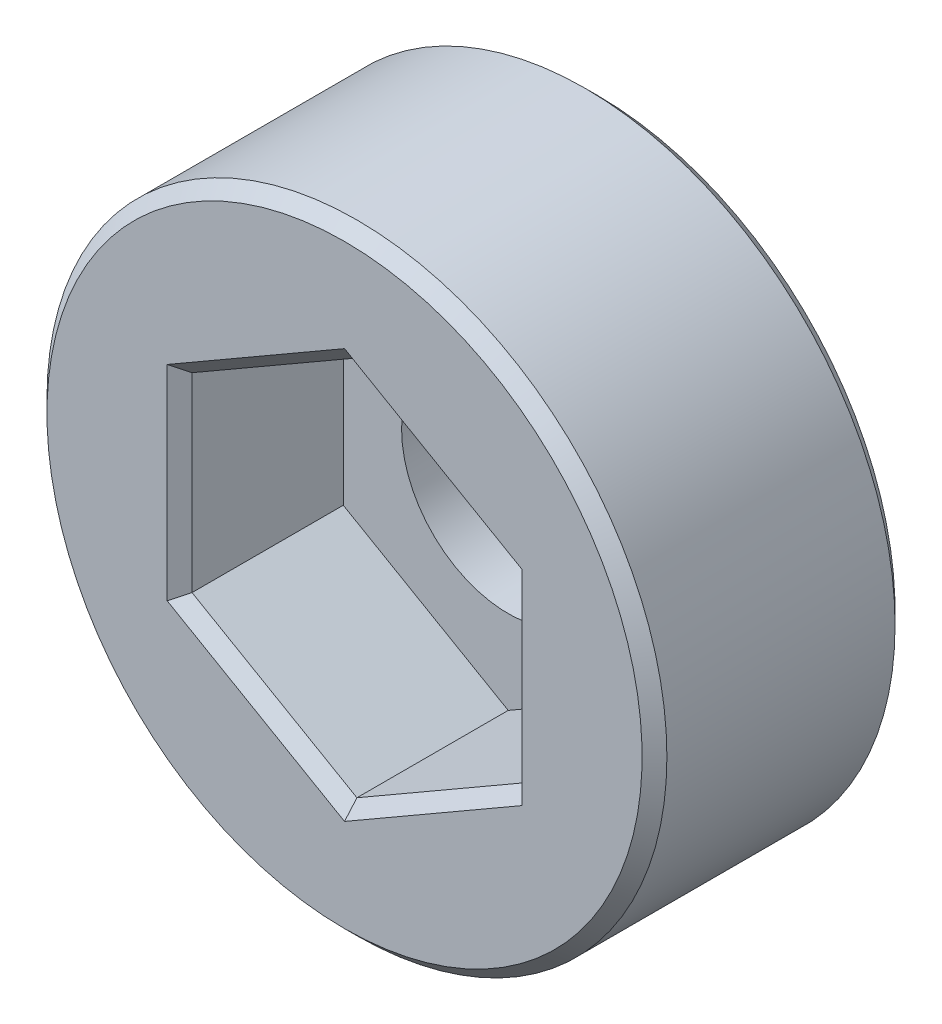
ISO-10303-21;
HEADER;
FILE_DESCRIPTION(('STEP AP214'),'2;1');
FILE_NAME('part.step','',(''),(''),'','','');
FILE_SCHEMA(('AUTOMOTIVE_DESIGN { 1 0 10303 214 1 1 1 1 }'));
ENDSEC;
DATA;
#1=APPLICATION_CONTEXT('core data for automotive mechanical design processes');
#2=APPLICATION_PROTOCOL_DEFINITION('international standard','automotive_design',2000,#1);
#3=PRODUCT_CONTEXT('',#1,'mechanical');
#4=PRODUCT('Part','Part','',(#3));
#5=PRODUCT_RELATED_PRODUCT_CATEGORY('part','',(#4));
#6=PRODUCT_DEFINITION_FORMATION('','',#4);
#7=PRODUCT_DEFINITION_CONTEXT('part definition',#1,'design');
#8=PRODUCT_DEFINITION('design','',#6,#7);
#9=PRODUCT_DEFINITION_SHAPE('','',#8);
#10=(LENGTH_UNIT() NAMED_UNIT(*) SI_UNIT(.MILLI.,.METRE.));
#11=(NAMED_UNIT(*) PLANE_ANGLE_UNIT() SI_UNIT($,.RADIAN.));
#12=(NAMED_UNIT(*) SI_UNIT($,.STERADIAN.) SOLID_ANGLE_UNIT());
#13=UNCERTAINTY_MEASURE_WITH_UNIT(LENGTH_MEASURE(1.E-05),#10,'distance_accuracy_value','');
#14=(GEOMETRIC_REPRESENTATION_CONTEXT(3) GLOBAL_UNCERTAINTY_ASSIGNED_CONTEXT((#13)) GLOBAL_UNIT_ASSIGNED_CONTEXT((#10,
#11,#12)) REPRESENTATION_CONTEXT('',''));
#15=CARTESIAN_POINT('',(0.,0.,0.));
#16=DIRECTION('',(0.,0.,1.));
#17=DIRECTION('',(1.,0.,0.));
#18=AXIS2_PLACEMENT_3D('',#15,#16,#17);
#19=CARTESIAN_POINT('',(0.,12.5,10.2));
#20=DIRECTION('',(0.,0.,-1.));
#21=DIRECTION('',(0.,1.,0.));
#22=AXIS2_PLACEMENT_3D('',#19,#20,#21);
#23=PLANE('',#22);
#24=CARTESIAN_POINT('',(0.,0.,10.2));
#25=DIRECTION('',(0.,0.,-1.));
#26=DIRECTION('',(0.,1.,0.));
#27=AXIS2_PLACEMENT_3D('',#24,#25,#26);
#28=CIRCLE('',#27,12.);
#29=CARTESIAN_POINT('',(0.,12.,10.2));
#30=VERTEX_POINT('',#29);
#31=EDGE_CURVE('E163',#30,#30,#28,.F.);
#32=ORIENTED_EDGE('',*,*,#31,.T.);
#33=EDGE_LOOP('',(#32));
#34=FACE_BOUND('',#33,.T.);
#35=DIRECTION('',(0.866025403784439,-0.5,0.));
#36=VECTOR('',#35,1.);
#37=CARTESIAN_POINT('',(-1.83765877365274,9.31708163705873,10.2));
#38=LINE('',#37,#36);
#39=CARTESIAN_POINT('',(0.,8.25610884941165,10.2));
#40=VERTEX_POINT('',#39);
#41=CARTESIAN_POINT('',(7.15,4.12805442470583,10.2));
#42=VERTEX_POINT('',#41);
#43=EDGE_CURVE('E158',#40,#42,#38,.T.);
#44=ORIENTED_EDGE('',*,*,#43,.T.);
#45=DIRECTION('',(0.,-1.,0.));
#46=VECTOR('',#45,1.);
#47=CARTESIAN_POINT('',(7.15,12.5,10.2));
#48=LINE('',#47,#46);
#49=CARTESIAN_POINT('',(7.15,-4.12805442470583,10.2));
#50=VERTEX_POINT('',#49);
#51=EDGE_CURVE('E160',#42,#50,#48,.T.);
#52=ORIENTED_EDGE('',*,*,#51,.T.);
#53=DIRECTION('',(-0.866025403784439,-0.5,0.));
#54=VECTOR('',#53,1.);
#55=CARTESIAN_POINT('',(8.98765877365274,-3.06708163705875,10.2));
#56=LINE('',#55,#54);
#57=CARTESIAN_POINT('',(0.,-8.25610884941165,10.2));
#58=VERTEX_POINT('',#57);
#59=EDGE_CURVE('E141',#50,#58,#56,.T.);
#60=ORIENTED_EDGE('',*,*,#59,.T.);
#61=DIRECTION('',(-0.866025403784439,0.5,0.));
#62=VECTOR('',#61,1.);
#63=CARTESIAN_POINT('',(-8.98765877365274,-3.06708163705875,10.2));
#64=LINE('',#63,#62);
#65=CARTESIAN_POINT('',(-7.15,-4.12805442470583,10.2));
#66=VERTEX_POINT('',#65);
#67=EDGE_CURVE('E152',#58,#66,#64,.T.);
#68=ORIENTED_EDGE('',*,*,#67,.T.);
#69=DIRECTION('',(0.,1.,0.));
#70=VECTOR('',#69,1.);
#71=CARTESIAN_POINT('',(-7.15,12.5,10.2));
#72=LINE('',#71,#70);
#73=CARTESIAN_POINT('',(-7.15,4.12805442470583,10.2));
#74=VERTEX_POINT('',#73);
#75=EDGE_CURVE('E154',#66,#74,#72,.T.);
#76=ORIENTED_EDGE('',*,*,#75,.T.);
#77=DIRECTION('',(0.866025403784439,0.5,0.));
#78=VECTOR('',#77,1.);
#79=CARTESIAN_POINT('',(1.83765877365274,9.31708163705874,10.2));
#80=LINE('',#79,#78);
#81=EDGE_CURVE('E156',#74,#40,#80,.T.);
#82=ORIENTED_EDGE('',*,*,#81,.T.);
#83=EDGE_LOOP('',(#44,#52,#60,#68,#76,#82));
#84=FACE_BOUND('',#83,.T.);
#85=ADVANCED_FACE('F32',(#34,#84),#23,.F.);
#86=CARTESIAN_POINT('',(0.,0.,10.2));
#87=DIRECTION('',(0.,0.,1.));
#88=DIRECTION('',(0.,-1.,0.));
#89=AXIS2_PLACEMENT_3D('',#86,#87,#88);
#90=CYLINDRICAL_SURFACE('',#89,12.5);
#91=CARTESIAN_POINT('',(0.,0.,9.69999999999999));
#92=DIRECTION('',(0.,0.,-1.));
#93=DIRECTION('',(0.,1.,0.));
#94=AXIS2_PLACEMENT_3D('',#91,#92,#93);
#95=CIRCLE('',#94,12.5);
#96=CARTESIAN_POINT('',(0.,12.5,9.69999999999999));
#97=VERTEX_POINT('',#96);
#98=EDGE_CURVE('E169',#97,#97,#95,.T.);
#99=ORIENTED_EDGE('',*,*,#98,.T.);
#100=EDGE_LOOP('',(#99));
#101=FACE_BOUND('',#100,.T.);
#102=CARTESIAN_POINT('',(0.,0.,0.499999999999994));
#103=DIRECTION('',(0.,0.,1.));
#104=DIRECTION('',(0.,-1.,0.));
#105=AXIS2_PLACEMENT_3D('',#102,#103,#104);
#106=CIRCLE('',#105,12.5);
#107=CARTESIAN_POINT('',(0.,-12.5,0.499999999999991));
#108=VERTEX_POINT('',#107);
#109=EDGE_CURVE('E166',#108,#108,#106,.T.);
#110=ORIENTED_EDGE('',*,*,#109,.T.);
#111=EDGE_LOOP('',(#110));
#112=FACE_BOUND('',#111,.T.);
#113=ADVANCED_FACE('F241',(#101,#112),#90,.T.);
#114=CARTESIAN_POINT('',(0.,12.5,0.));
#115=DIRECTION('',(0.,0.,1.));
#116=DIRECTION('',(0.,-1.,0.));
#117=AXIS2_PLACEMENT_3D('',#114,#115,#116);
#118=PLANE('',#117);
#119=CARTESIAN_POINT('',(0.,0.,0.));
#120=DIRECTION('',(0.,0.,1.));
#121=DIRECTION('',(0.,-1.,0.));
#122=AXIS2_PLACEMENT_3D('',#119,#120,#121);
#123=CIRCLE('',#122,4.79999999999999);
#124=CARTESIAN_POINT('',(0.,-4.79999999999999,0.));
#125=VERTEX_POINT('',#124);
#126=EDGE_CURVE('E41',#125,#125,#123,.T.);
#127=ORIENTED_EDGE('',*,*,#126,.T.);
#128=EDGE_LOOP('',(#127));
#129=FACE_BOUND('',#128,.T.);
#130=CARTESIAN_POINT('',(0.,0.,0.));
#131=DIRECTION('',(0.,0.,1.));
#132=DIRECTION('',(0.,-1.,0.));
#133=AXIS2_PLACEMENT_3D('',#130,#131,#132);
#134=CIRCLE('',#133,12.);
#135=CARTESIAN_POINT('',(0.,-12.,0.));
#136=VERTEX_POINT('',#135);
#137=EDGE_CURVE('E183',#136,#136,#134,.F.);
#138=ORIENTED_EDGE('',*,*,#137,.T.);
#139=EDGE_LOOP('',(#138));
#140=FACE_BOUND('',#139,.T.);
#141=ADVANCED_FACE('F237',(#129,#140),#118,.F.);
#142=CARTESIAN_POINT('',(-6.65,-3.83937929011101,3.6));
#143=DIRECTION('',(-0.5,-0.866025403784439,0.));
#144=DIRECTION('',(0.866025403784439,-0.5,0.));
#145=AXIS2_PLACEMENT_3D('',#142,#143,#144);
#146=PLANE('',#145);
#147=DIRECTION('',(0.,0.,1.));
#148=VECTOR('',#147,1.);
#149=CARTESIAN_POINT('',(-6.65,-3.83937929011101,3.6));
#150=LINE('',#149,#148);
#151=CARTESIAN_POINT('',(-6.65,-3.83937929011101,3.6));
#152=VERTEX_POINT('',#151);
#153=CARTESIAN_POINT('',(-6.65,-3.83937929011101,9.69999999999999));
#154=VERTEX_POINT('',#153);
#155=EDGE_CURVE('E139',#152,#154,#150,.T.);
#156=ORIENTED_EDGE('',*,*,#155,.T.);
#157=DIRECTION('',(0.866025403784439,-0.5,0.));
#158=VECTOR('',#157,1.);
#159=CARTESIAN_POINT('',(-6.65,-3.83937929011101,9.69999999999999));
#160=LINE('',#159,#158);
#161=CARTESIAN_POINT('',(0.,-7.67875858022202,9.69999999999999));
#162=VERTEX_POINT('',#161);
#163=EDGE_CURVE('E49',#154,#162,#160,.T.);
#164=ORIENTED_EDGE('',*,*,#163,.T.);
#165=DIRECTION('',(0.,0.,1.));
#166=VECTOR('',#165,1.);
#167=CARTESIAN_POINT('',(0.,-7.67875858022202,3.6));
#168=LINE('',#167,#166);
#169=CARTESIAN_POINT('',(0.,-7.67875858022202,3.6));
#170=VERTEX_POINT('',#169);
#171=EDGE_CURVE('E104',#170,#162,#168,.T.);
#172=ORIENTED_EDGE('',*,*,#171,.F.);
#173=DIRECTION('',(0.866025403784439,-0.5,0.));
#174=VECTOR('',#173,1.);
#175=CARTESIAN_POINT('',(-6.65,-3.83937929011101,3.6));
#176=LINE('',#175,#174);
#177=EDGE_CURVE('E108',#152,#170,#176,.T.);
#178=ORIENTED_EDGE('',*,*,#177,.F.);
#179=EDGE_LOOP('',(#156,#164,#172,#178));
#180=FACE_BOUND('',#179,.T.);
#181=ADVANCED_FACE('F106',(#180),#146,.F.);
#182=CARTESIAN_POINT('',(-6.65,3.83937929011101,3.6));
#183=DIRECTION('',(-1.,0.,0.));
#184=DIRECTION('',(0.,0.,1.));
#185=AXIS2_PLACEMENT_3D('',#182,#183,#184);
#186=PLANE('',#185);
#187=DIRECTION('',(0.,0.,1.));
#188=VECTOR('',#187,1.);
#189=CARTESIAN_POINT('',(-6.65,3.83937929011101,3.6));
#190=LINE('',#189,#188);
#191=CARTESIAN_POINT('',(-6.65,3.83937929011101,3.6));
#192=VERTEX_POINT('',#191);
#193=CARTESIAN_POINT('',(-6.65,3.83937929011101,9.69999999999999));
#194=VERTEX_POINT('',#193);
#195=EDGE_CURVE('E142',#192,#194,#190,.T.);
#196=ORIENTED_EDGE('',*,*,#195,.T.);
#197=DIRECTION('',(0.,-1.,0.));
#198=VECTOR('',#197,1.);
#199=CARTESIAN_POINT('',(-6.65,3.83937929011101,9.69999999999999));
#200=LINE('',#199,#198);
#201=EDGE_CURVE('E57',#194,#154,#200,.T.);
#202=ORIENTED_EDGE('',*,*,#201,.T.);
#203=ORIENTED_EDGE('',*,*,#155,.F.);
#204=DIRECTION('',(0.,-1.,0.));
#205=VECTOR('',#204,1.);
#206=CARTESIAN_POINT('',(-6.65,3.83937929011101,3.6));
#207=LINE('',#206,#205);
#208=EDGE_CURVE('E113',#192,#152,#207,.T.);
#209=ORIENTED_EDGE('',*,*,#208,.F.);
#210=EDGE_LOOP('',(#196,#202,#203,#209));
#211=FACE_BOUND('',#210,.T.);
#212=ADVANCED_FACE('F229',(#211),#186,.F.);
#213=CARTESIAN_POINT('',(0.,7.67875858022202,3.6));
#214=DIRECTION('',(-0.5,0.866025403784439,0.));
#215=DIRECTION('',(-0.866025403784439,-0.5,0.));
#216=AXIS2_PLACEMENT_3D('',#213,#214,#215);
#217=PLANE('',#216);
#218=DIRECTION('',(0.,0.,1.));
#219=VECTOR('',#218,1.);
#220=CARTESIAN_POINT('',(0.,7.67875858022202,3.6));
#221=LINE('',#220,#219);
#222=CARTESIAN_POINT('',(0.,7.67875858022202,3.6));
#223=VERTEX_POINT('',#222);
#224=CARTESIAN_POINT('',(0.,7.67875858022202,9.69999999999999));
#225=VERTEX_POINT('',#224);
#226=EDGE_CURVE('E144',#223,#225,#221,.T.);
#227=ORIENTED_EDGE('',*,*,#226,.T.);
#228=DIRECTION('',(-0.866025403784439,-0.5,0.));
#229=VECTOR('',#228,1.);
#230=CARTESIAN_POINT('',(0.,7.67875858022202,9.69999999999999));
#231=LINE('',#230,#229);
#232=EDGE_CURVE('E177',#225,#194,#231,.T.);
#233=ORIENTED_EDGE('',*,*,#232,.T.);
#234=ORIENTED_EDGE('',*,*,#195,.F.);
#235=DIRECTION('',(-0.866025403784439,-0.5,0.));
#236=VECTOR('',#235,1.);
#237=CARTESIAN_POINT('',(0.,7.67875858022202,3.6));
#238=LINE('',#237,#236);
#239=EDGE_CURVE('E136',#223,#192,#238,.T.);
#240=ORIENTED_EDGE('',*,*,#239,.F.);
#241=EDGE_LOOP('',(#227,#233,#234,#240));
#242=FACE_BOUND('',#241,.T.);
#243=ADVANCED_FACE('F228',(#242),#217,.F.);
#244=CARTESIAN_POINT('',(6.65,3.83937929011101,3.6));
#245=DIRECTION('',(0.5,0.866025403784439,0.));
#246=DIRECTION('',(-0.866025403784439,0.5,0.));
#247=AXIS2_PLACEMENT_3D('',#244,#245,#246);
#248=PLANE('',#247);
#249=DIRECTION('',(0.,0.,1.));
#250=VECTOR('',#249,1.);
#251=CARTESIAN_POINT('',(6.65,3.83937929011101,3.6));
#252=LINE('',#251,#250);
#253=CARTESIAN_POINT('',(6.65,3.83937929011101,3.6));
#254=VERTEX_POINT('',#253);
#255=CARTESIAN_POINT('',(6.65,3.83937929011101,9.7));
#256=VERTEX_POINT('',#255);
#257=EDGE_CURVE('E147',#254,#256,#252,.T.);
#258=ORIENTED_EDGE('',*,*,#257,.T.);
#259=DIRECTION('',(-0.866025403784439,0.5,0.));
#260=VECTOR('',#259,1.);
#261=CARTESIAN_POINT('',(6.65,3.83937929011101,9.69999999999999));
#262=LINE('',#261,#260);
#263=EDGE_CURVE('E175',#256,#225,#262,.T.);
#264=ORIENTED_EDGE('',*,*,#263,.T.);
#265=ORIENTED_EDGE('',*,*,#226,.F.);
#266=DIRECTION('',(-0.866025403784439,0.5,0.));
#267=VECTOR('',#266,1.);
#268=CARTESIAN_POINT('',(6.65,3.83937929011101,3.6));
#269=LINE('',#268,#267);
#270=EDGE_CURVE('E133',#254,#223,#269,.T.);
#271=ORIENTED_EDGE('',*,*,#270,.F.);
#272=EDGE_LOOP('',(#258,#264,#265,#271));
#273=FACE_BOUND('',#272,.T.);
#274=ADVANCED_FACE('F225',(#273),#248,.F.);
#275=CARTESIAN_POINT('',(6.65,-3.83937929011101,3.6));
#276=DIRECTION('',(1.,0.,0.));
#277=DIRECTION('',(0.,1.,0.));
#278=AXIS2_PLACEMENT_3D('',#275,#276,#277);
#279=PLANE('',#278);
#280=DIRECTION('',(0.,0.,1.));
#281=VECTOR('',#280,1.);
#282=CARTESIAN_POINT('',(6.65,-3.83937929011101,3.6));
#283=LINE('',#282,#281);
#284=CARTESIAN_POINT('',(6.65,-3.83937929011101,3.6));
#285=VERTEX_POINT('',#284);
#286=CARTESIAN_POINT('',(6.65,-3.83937929011101,9.69999999999999));
#287=VERTEX_POINT('',#286);
#288=EDGE_CURVE('E112',#285,#287,#283,.T.);
#289=ORIENTED_EDGE('',*,*,#288,.T.);
#290=DIRECTION('',(0.,1.,0.));
#291=VECTOR('',#290,1.);
#292=CARTESIAN_POINT('',(6.65,-3.83937929011101,9.69999999999999));
#293=LINE('',#292,#291);
#294=EDGE_CURVE('E172',#287,#256,#293,.T.);
#295=ORIENTED_EDGE('',*,*,#294,.T.);
#296=ORIENTED_EDGE('',*,*,#257,.F.);
#297=DIRECTION('',(0.,1.,0.));
#298=VECTOR('',#297,1.);
#299=CARTESIAN_POINT('',(6.65,-3.83937929011101,3.6));
#300=LINE('',#299,#298);
#301=EDGE_CURVE('E122',#285,#254,#300,.T.);
#302=ORIENTED_EDGE('',*,*,#301,.F.);
#303=EDGE_LOOP('',(#289,#295,#296,#302));
#304=FACE_BOUND('',#303,.T.);
#305=ADVANCED_FACE('F221',(#304),#279,.F.);
#306=CARTESIAN_POINT('',(0.,-7.67875858022202,3.6));
#307=DIRECTION('',(0.5,-0.866025403784439,0.));
#308=DIRECTION('',(0.866025403784439,0.5,0.));
#309=AXIS2_PLACEMENT_3D('',#306,#307,#308);
#310=PLANE('',#309);
#311=ORIENTED_EDGE('',*,*,#171,.T.);
#312=DIRECTION('',(0.866025403784439,0.5,0.));
#313=VECTOR('',#312,1.);
#314=CARTESIAN_POINT('',(0.,-7.67875858022202,9.69999999999999));
#315=LINE('',#314,#313);
#316=EDGE_CURVE('E181',#162,#287,#315,.T.);
#317=ORIENTED_EDGE('',*,*,#316,.T.);
#318=ORIENTED_EDGE('',*,*,#288,.F.);
#319=DIRECTION('',(0.866025403784439,0.5,0.));
#320=VECTOR('',#319,1.);
#321=CARTESIAN_POINT('',(0.,-7.67875858022202,3.6));
#322=LINE('',#321,#320);
#323=EDGE_CURVE('E116',#170,#285,#322,.T.);
#324=ORIENTED_EDGE('',*,*,#323,.F.);
#325=EDGE_LOOP('',(#311,#317,#318,#324));
#326=FACE_BOUND('',#325,.T.);
#327=ADVANCED_FACE('F117',(#326),#310,.F.);
#328=CARTESIAN_POINT('',(0.,0.,3.6));
#329=DIRECTION('',(0.,0.,1.));
#330=DIRECTION('',(1.,0.,0.));
#331=AXIS2_PLACEMENT_3D('',#328,#329,#330);
#332=PLANE('',#331);
#333=CARTESIAN_POINT('',(0.,0.,3.6));
#334=DIRECTION('',(0.,0.,1.));
#335=DIRECTION('',(1.,0.,0.));
#336=AXIS2_PLACEMENT_3D('',#333,#334,#335);
#337=CIRCLE('',#336,4.3);
#338=CARTESIAN_POINT('',(4.3,0.,3.6));
#339=VERTEX_POINT('',#338);
#340=EDGE_CURVE('E127',#339,#339,#337,.T.);
#341=ORIENTED_EDGE('',*,*,#340,.F.);
#342=EDGE_LOOP('',(#341));
#343=FACE_BOUND('',#342,.T.);
#344=ORIENTED_EDGE('',*,*,#177,.T.);
#345=ORIENTED_EDGE('',*,*,#323,.T.);
#346=ORIENTED_EDGE('',*,*,#301,.T.);
#347=ORIENTED_EDGE('',*,*,#270,.T.);
#348=ORIENTED_EDGE('',*,*,#239,.T.);
#349=ORIENTED_EDGE('',*,*,#208,.T.);
#350=EDGE_LOOP('',(#344,#345,#346,#347,#348,#349));
#351=FACE_BOUND('',#350,.T.);
#352=ADVANCED_FACE('F124',(#343,#351),#332,.T.);
#353=CARTESIAN_POINT('',(0.,0.,0.));
#354=DIRECTION('',(0.,0.,1.));
#355=DIRECTION('',(1.,0.,0.));
#356=AXIS2_PLACEMENT_3D('',#353,#354,#355);
#357=CYLINDRICAL_SURFACE('',#356,4.3);
#358=CARTESIAN_POINT('',(0.,0.,0.499999999999988));
#359=DIRECTION('',(0.,0.,1.));
#360=DIRECTION('',(1.,0.,0.));
#361=AXIS2_PLACEMENT_3D('',#358,#359,#360);
#362=CIRCLE('',#361,4.3);
#363=CARTESIAN_POINT('',(4.3,0.,0.499999999999988));
#364=VERTEX_POINT('',#363);
#365=EDGE_CURVE('E11',#364,#364,#362,.F.);
#366=CARTESIAN_POINT('',(4.3,0.,0.499999999999988));
#367=CARTESIAN_POINT('',(4.3,0.,0.532291666666655));
#368=CARTESIAN_POINT('',(4.3,0.,0.564583333333322));
#369=CARTESIAN_POINT('',(4.3,0.,0.629166666666655));
#370=CARTESIAN_POINT('',(4.3,0.,0.661458333333322));
#371=CARTESIAN_POINT('',(4.3,0.,0.726041666666656));
#372=CARTESIAN_POINT('',(4.3,0.,0.758333333333322));
#373=CARTESIAN_POINT('',(4.3,0.,0.822916666666656));
#374=CARTESIAN_POINT('',(4.3,0.,0.855208333333323));
#375=CARTESIAN_POINT('',(4.3,0.,0.919791666666656));
#376=CARTESIAN_POINT('',(4.3,0.,0.952083333333323));
#377=CARTESIAN_POINT('',(4.3,0.,1.01666666666666));
#378=CARTESIAN_POINT('',(4.3,0.,1.04895833333332));
#379=CARTESIAN_POINT('',(4.3,0.,1.11354166666666));
#380=CARTESIAN_POINT('',(4.3,0.,1.14583333333332));
#381=CARTESIAN_POINT('',(4.3,0.,1.21041666666666));
#382=CARTESIAN_POINT('',(4.3,0.,1.24270833333332));
#383=CARTESIAN_POINT('',(4.3,0.,1.30729166666666));
#384=CARTESIAN_POINT('',(4.3,0.,1.33958333333332));
#385=CARTESIAN_POINT('',(4.3,0.,1.40416666666666));
#386=CARTESIAN_POINT('',(4.3,0.,1.43645833333332));
#387=CARTESIAN_POINT('',(4.3,0.,1.50104166666666));
#388=CARTESIAN_POINT('',(4.3,0.,1.53333333333332));
#389=CARTESIAN_POINT('',(4.3,0.,1.59791666666666));
#390=CARTESIAN_POINT('',(4.3,0.,1.63020833333332));
#391=CARTESIAN_POINT('',(4.3,0.,1.69479166666666));
#392=CARTESIAN_POINT('',(4.3,0.,1.72708333333333));
#393=CARTESIAN_POINT('',(4.3,0.,1.79166666666666));
#394=CARTESIAN_POINT('',(4.3,0.,1.82395833333333));
#395=CARTESIAN_POINT('',(4.3,0.,1.88854166666666));
#396=CARTESIAN_POINT('',(4.3,0.,1.92083333333333));
#397=CARTESIAN_POINT('',(4.3,0.,1.98541666666666));
#398=CARTESIAN_POINT('',(4.3,0.,2.01770833333333));
#399=CARTESIAN_POINT('',(4.3,0.,2.08229166666666));
#400=CARTESIAN_POINT('',(4.3,0.,2.11458333333333));
#401=CARTESIAN_POINT('',(4.3,0.,2.17916666666666));
#402=CARTESIAN_POINT('',(4.3,0.,2.21145833333333));
#403=CARTESIAN_POINT('',(4.3,0.,2.27604166666666));
#404=CARTESIAN_POINT('',(4.3,0.,2.30833333333333));
#405=CARTESIAN_POINT('',(4.3,0.,2.37291666666666));
#406=CARTESIAN_POINT('',(4.3,0.,2.40520833333333));
#407=CARTESIAN_POINT('',(4.3,0.,2.46979166666666));
#408=CARTESIAN_POINT('',(4.3,0.,2.50208333333333));
#409=CARTESIAN_POINT('',(4.3,0.,2.56666666666666));
#410=CARTESIAN_POINT('',(4.3,0.,2.59895833333333));
#411=CARTESIAN_POINT('',(4.3,0.,2.66354166666666));
#412=CARTESIAN_POINT('',(4.3,0.,2.69583333333333));
#413=CARTESIAN_POINT('',(4.3,0.,2.76041666666666));
#414=CARTESIAN_POINT('',(4.3,0.,2.79270833333333));
#415=CARTESIAN_POINT('',(4.3,0.,2.85729166666666));
#416=CARTESIAN_POINT('',(4.3,0.,2.88958333333333));
#417=CARTESIAN_POINT('',(4.3,0.,2.95416666666666));
#418=CARTESIAN_POINT('',(4.3,0.,2.98645833333333));
#419=CARTESIAN_POINT('',(4.3,0.,3.05104166666666));
#420=CARTESIAN_POINT('',(4.3,0.,3.08333333333333));
#421=CARTESIAN_POINT('',(4.3,0.,3.14791666666666));
#422=CARTESIAN_POINT('',(4.3,0.,3.18020833333333));
#423=CARTESIAN_POINT('',(4.3,0.,3.24479166666666));
#424=CARTESIAN_POINT('',(4.3,0.,3.27708333333333));
#425=CARTESIAN_POINT('',(4.3,0.,3.34166666666666));
#426=CARTESIAN_POINT('',(4.3,0.,3.37395833333333));
#427=CARTESIAN_POINT('',(4.3,0.,3.43854166666666));
#428=CARTESIAN_POINT('',(4.3,0.,3.47083333333333));
#429=CARTESIAN_POINT('',(4.3,0.,3.53541666666666));
#430=CARTESIAN_POINT('',(4.3,0.,3.56770833333333));
#431=CARTESIAN_POINT('',(4.3,0.,3.6));
#432=B_SPLINE_CURVE_WITH_KNOTS('',3,(#366,#367,#368,#369,#370,#371,#372,#373,#374,#375,#376,
#377,#378,#379,#380,#381,#382,#383,#384,#385,#386,#387,#388,#389,#390,#391,#392,#393,#394,#395,
#396,#397,#398,#399,#400,#401,#402,#403,#404,#405,#406,#407,#408,#409,#410,#411,#412,#413,#414,
#415,#416,#417,#418,#419,#420,#421,#422,#423,#424,#425,#426,#427,#428,#429,#430,#431),
.UNSPECIFIED.,.F.,.F.,(4,2,2,2,2,2,2,2,2,2,2,2,2,2,2,2,2,2,2,2,2,2,2,2,2,2,2,2,2,2,2,2,4),(0.,
0.0968750000000003,0.193750000000001,0.290625000000001,0.387500000000001,0.484375000000001,
0.581250000000002,0.678125000000002,0.775000000000002,0.871875000000003,0.968750000000003,
1.065625,1.1625,1.259375,1.35625,1.453125,1.55,1.646875,1.74375000000001,1.84062500000001,
1.93750000000001,2.03437500000001,2.13125000000001,2.22812500000001,2.32500000000001,
2.42187500000001,2.51875000000001,2.61562500000001,2.71250000000001,2.80937500000001,
2.90625000000001,3.00312500000001,3.10000000000001),.UNSPECIFIED.);
#433=EDGE_CURVE('BSEAM254',#364,#339,#432,.T.);
#434=ORIENTED_EDGE('',*,*,#365,.T.);
#435=ORIENTED_EDGE('',*,*,#340,.T.);
#436=ORIENTED_EDGE('',*,*,#433,.T.);
#437=ORIENTED_EDGE('',*,*,#433,.F.);
#438=EDGE_LOOP('',(#434,#436,#435,#437));
#439=FACE_BOUND('',#438,.T.);
#440=ADVANCED_FACE('F254',(#439),#357,.F.);
#441=CARTESIAN_POINT('',(0.,0.,10.2));
#442=DIRECTION('',(0.,0.,-1.));
#443=DIRECTION('',(0.,1.,0.));
#444=AXIS2_PLACEMENT_3D('',#441,#442,#443);
#445=CONICAL_SURFACE('',#444,12.,0.785398163397443);
#446=ORIENTED_EDGE('',*,*,#98,.F.);
#447=EDGE_LOOP('',(#446));
#448=FACE_BOUND('',#447,.T.);
#449=ORIENTED_EDGE('',*,*,#31,.F.);
#450=EDGE_LOOP('',(#449));
#451=FACE_BOUND('',#450,.T.);
#452=ADVANCED_FACE('F251',(#448,#451),#445,.T.);
#453=CARTESIAN_POINT('',(-6.65,3.83937929011101,9.69999999999999));
#454=DIRECTION('',(-0.707106781186549,0.,-0.707106781186546));
#455=DIRECTION('',(0.,-1.,0.));
#456=AXIS2_PLACEMENT_3D('',#453,#454,#455);
#457=PLANE('',#456);
#458=DIRECTION('',(-0.654653670707976,0.377964473009226,0.654653670707979));
#459=VECTOR('',#458,1.);
#460=CARTESIAN_POINT('',(-4.75000000000001,2.74241377865073,7.79999999999999));
#461=LINE('',#460,#459);
#462=EDGE_CURVE('E197',#74,#194,#461,.F.);
#463=ORIENTED_EDGE('',*,*,#462,.F.);
#464=ORIENTED_EDGE('',*,*,#75,.F.);
#465=DIRECTION('',(-0.654653670707975,-0.377964473009231,0.654653670707977));
#466=VECTOR('',#465,1.);
#467=CARTESIAN_POINT('',(-4.74999999999998,-2.7424137786507,7.79999999999997));
#468=LINE('',#467,#466);
#469=EDGE_CURVE('E36',#154,#66,#468,.T.);
#470=ORIENTED_EDGE('',*,*,#469,.F.);
#471=ORIENTED_EDGE('',*,*,#201,.F.);
#472=EDGE_LOOP('',(#463,#464,#470,#471));
#473=FACE_BOUND('',#472,.T.);
#474=ADVANCED_FACE('F210',(#473),#457,.F.);
#475=CARTESIAN_POINT('',(-6.65,-3.83937929011101,9.69999999999999));
#476=DIRECTION('',(-0.353553390593273,-0.612372435695793,-0.707106781186549));
#477=DIRECTION('',(0.866025403784439,-0.5,0.));
#478=AXIS2_PLACEMENT_3D('',#475,#476,#477);
#479=PLANE('',#478);
#480=ORIENTED_EDGE('',*,*,#469,.T.);
#481=ORIENTED_EDGE('',*,*,#67,.F.);
#482=DIRECTION('',(0.,-0.755928946018456,0.654653670707976));
#483=VECTOR('',#482,1.);
#484=CARTESIAN_POINT('',(0.,-5.48482755730144,7.8));
#485=LINE('',#484,#483);
#486=EDGE_CURVE('E195',#162,#58,#485,.T.);
#487=ORIENTED_EDGE('',*,*,#486,.F.);
#488=ORIENTED_EDGE('',*,*,#163,.F.);
#489=EDGE_LOOP('',(#480,#481,#487,#488));
#490=FACE_BOUND('',#489,.T.);
#491=ADVANCED_FACE('F207',(#490),#479,.F.);
#492=CARTESIAN_POINT('',(0.,7.67875858022202,9.69999999999999));
#493=DIRECTION('',(-0.353553390593275,0.612372435695796,-0.707106781186546));
#494=DIRECTION('',(-0.866025403784439,-0.5,0.));
#495=AXIS2_PLACEMENT_3D('',#492,#493,#494);
#496=PLANE('',#495);
#497=ORIENTED_EDGE('',*,*,#462,.T.);
#498=ORIENTED_EDGE('',*,*,#232,.F.);
#499=DIRECTION('',(0.,0.755928946018453,0.654653670707979));
#500=VECTOR('',#499,1.);
#501=CARTESIAN_POINT('',(0.,5.48482755730145,7.79999999999998));
#502=LINE('',#501,#500);
#503=EDGE_CURVE('E192',#40,#225,#502,.F.);
#504=ORIENTED_EDGE('',*,*,#503,.F.);
#505=ORIENTED_EDGE('',*,*,#81,.F.);
#506=EDGE_LOOP('',(#497,#498,#504,#505));
#507=FACE_BOUND('',#506,.T.);
#508=ADVANCED_FACE('F267',(#507),#496,.F.);
#509=CARTESIAN_POINT('',(0.,-7.67875858022202,9.69999999999999));
#510=DIRECTION('',(0.353553390593273,-0.612372435695793,-0.707106781186549));
#511=DIRECTION('',(0.866025403784439,0.5,0.));
#512=AXIS2_PLACEMENT_3D('',#509,#510,#511);
#513=PLANE('',#512);
#514=ORIENTED_EDGE('',*,*,#486,.T.);
#515=ORIENTED_EDGE('',*,*,#59,.F.);
#516=DIRECTION('',(-0.654653670707976,0.37796447300923,-0.654653670707977));
#517=VECTOR('',#516,1.);
#518=CARTESIAN_POINT('',(6.65,-3.83937929011101,9.69999999999999));
#519=LINE('',#518,#517);
#520=EDGE_CURVE('E190',#287,#50,#519,.F.);
#521=ORIENTED_EDGE('',*,*,#520,.F.);
#522=ORIENTED_EDGE('',*,*,#316,.F.);
#523=EDGE_LOOP('',(#514,#515,#521,#522));
#524=FACE_BOUND('',#523,.T.);
#525=ADVANCED_FACE('F217',(#524),#513,.F.);
#526=CARTESIAN_POINT('',(6.65,3.83937929011101,9.69999999999999));
#527=DIRECTION('',(0.353553390593275,0.612372435695797,-0.707106781186545));
#528=DIRECTION('',(-0.866025403784439,0.5,0.));
#529=AXIS2_PLACEMENT_3D('',#526,#527,#528);
#530=PLANE('',#529);
#531=ORIENTED_EDGE('',*,*,#503,.T.);
#532=ORIENTED_EDGE('',*,*,#263,.F.);
#533=DIRECTION('',(0.654653670707978,0.377964473009223,0.654653670707979));
#534=VECTOR('',#533,1.);
#535=CARTESIAN_POINT('',(4.75000000000001,2.74241377865075,7.80000000000001));
#536=LINE('',#535,#534);
#537=EDGE_CURVE('E188',#42,#256,#536,.F.);
#538=ORIENTED_EDGE('',*,*,#537,.F.);
#539=ORIENTED_EDGE('',*,*,#43,.F.);
#540=EDGE_LOOP('',(#531,#532,#538,#539));
#541=FACE_BOUND('',#540,.T.);
#542=ADVANCED_FACE('F260',(#541),#530,.F.);
#543=CARTESIAN_POINT('',(6.65,-3.83937929011101,9.69999999999999));
#544=DIRECTION('',(0.707106781186548,0.,-0.707106781186547));
#545=DIRECTION('',(0.,1.,0.));
#546=AXIS2_PLACEMENT_3D('',#543,#544,#545);
#547=PLANE('',#546);
#548=ORIENTED_EDGE('',*,*,#520,.T.);
#549=ORIENTED_EDGE('',*,*,#51,.F.);
#550=ORIENTED_EDGE('',*,*,#537,.T.);
#551=ORIENTED_EDGE('',*,*,#294,.F.);
#552=EDGE_LOOP('',(#548,#549,#550,#551));
#553=FACE_BOUND('',#552,.T.);
#554=ADVANCED_FACE('F256',(#553),#547,.F.);
#555=CARTESIAN_POINT('',(0.,0.,0.));
#556=DIRECTION('',(0.,0.,-1.));
#557=DIRECTION('',(-1.,0.,0.));
#558=AXIS2_PLACEMENT_3D('',#555,#556,#557);
#559=CONICAL_SURFACE('',#558,4.79999999999999,0.785398163397446);
#560=ORIENTED_EDGE('',*,*,#365,.F.);
#561=EDGE_LOOP('',(#560));
#562=FACE_BOUND('',#561,.T.);
#563=ORIENTED_EDGE('',*,*,#126,.F.);
#564=EDGE_LOOP('',(#563));
#565=FACE_BOUND('',#564,.T.);
#566=ADVANCED_FACE('F259',(#562,#565),#559,.F.);
#567=CARTESIAN_POINT('',(0.,0.,0.499999999999994));
#568=DIRECTION('',(0.,0.,1.));
#569=DIRECTION('',(0.,-1.,0.));
#570=AXIS2_PLACEMENT_3D('',#567,#568,#569);
#571=CONICAL_SURFACE('',#570,12.5,0.785398163397452);
#572=ORIENTED_EDGE('',*,*,#137,.F.);
#573=EDGE_LOOP('',(#572));
#574=FACE_BOUND('',#573,.T.);
#575=ORIENTED_EDGE('',*,*,#109,.F.);
#576=EDGE_LOOP('',(#575));
#577=FACE_BOUND('',#576,.T.);
#578=ADVANCED_FACE('F34',(#574,#577),#571,.T.);
#579=CLOSED_SHELL('',(#85,#113,#141,#181,#212,#243,#274,#305,#327,#352,#440,#452,#474,#491,#508,
#525,#542,#554,#566,#578));
#580=MANIFOLD_SOLID_BREP('B2',#579);
#581=ADVANCED_BREP_SHAPE_REPRESENTATION('',(#18,#580),#14);
#582=SHAPE_DEFINITION_REPRESENTATION(#9,#581);
ENDSEC;
END-ISO-10303-21;
